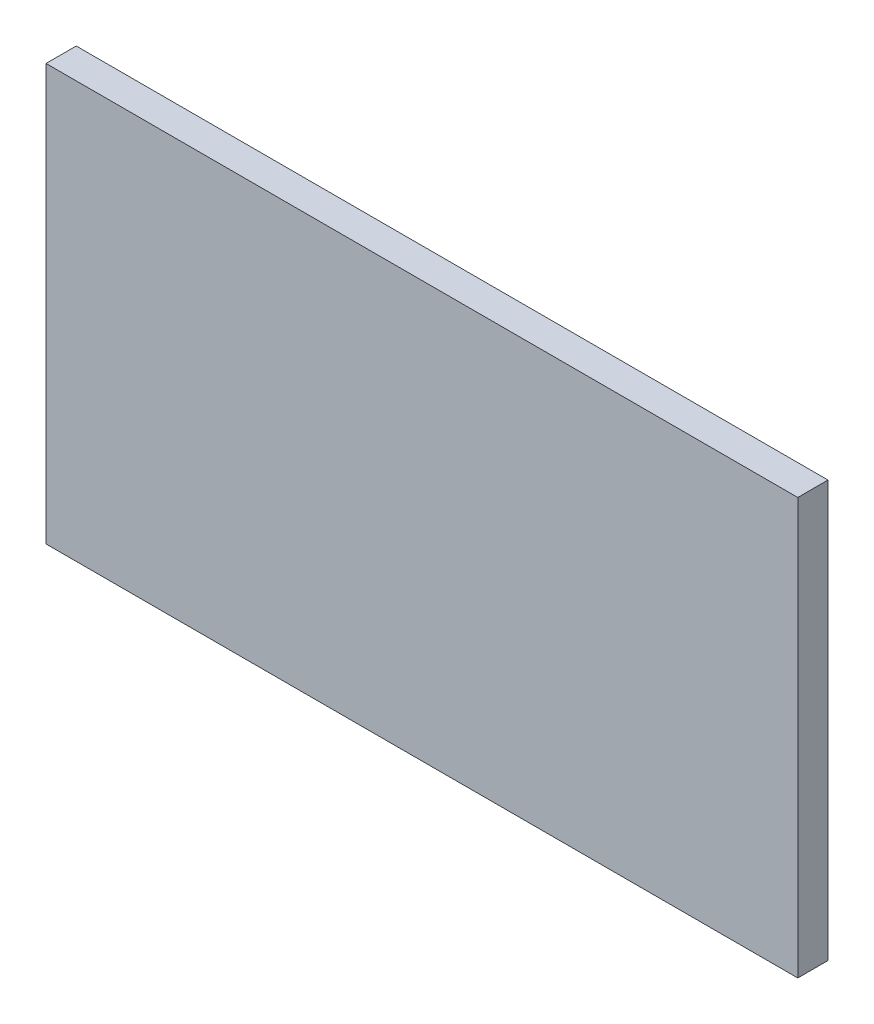
ISO-10303-21;
HEADER;
FILE_DESCRIPTION(('STEP AP214'),'2;1');
FILE_NAME('part.step','',(''),(''),'','','');
FILE_SCHEMA(('AUTOMOTIVE_DESIGN { 1 0 10303 214 1 1 1 1 }'));
ENDSEC;
DATA;
#1=APPLICATION_CONTEXT('core data for automotive mechanical design processes');
#2=APPLICATION_PROTOCOL_DEFINITION('international standard','automotive_design',2000,#1);
#3=PRODUCT_CONTEXT('',#1,'mechanical');
#4=PRODUCT('Part','Part','',(#3));
#5=PRODUCT_RELATED_PRODUCT_CATEGORY('part','',(#4));
#6=PRODUCT_DEFINITION_FORMATION('','',#4);
#7=PRODUCT_DEFINITION_CONTEXT('part definition',#1,'design');
#8=PRODUCT_DEFINITION('design','',#6,#7);
#9=PRODUCT_DEFINITION_SHAPE('','',#8);
#10=(LENGTH_UNIT() NAMED_UNIT(*) SI_UNIT(.MILLI.,.METRE.));
#11=(NAMED_UNIT(*) PLANE_ANGLE_UNIT() SI_UNIT($,.RADIAN.));
#12=(NAMED_UNIT(*) SI_UNIT($,.STERADIAN.) SOLID_ANGLE_UNIT());
#13=UNCERTAINTY_MEASURE_WITH_UNIT(LENGTH_MEASURE(1.E-05),#10,'distance_accuracy_value','');
#14=(GEOMETRIC_REPRESENTATION_CONTEXT(3) GLOBAL_UNCERTAINTY_ASSIGNED_CONTEXT((#13)) GLOBAL_UNIT_ASSIGNED_CONTEXT((#10,
#11,#12)) REPRESENTATION_CONTEXT('',''));
#15=CARTESIAN_POINT('',(0.,0.,0.));
#16=DIRECTION('',(0.,0.,1.));
#17=DIRECTION('',(1.,0.,0.));
#18=AXIS2_PLACEMENT_3D('',#15,#16,#17);
#19=CARTESIAN_POINT('',(0.,0.,9.));
#20=DIRECTION('',(1.,0.,0.));
#21=DIRECTION('',(0.,0.,-1.));
#22=AXIS2_PLACEMENT_3D('',#19,#20,#21);
#23=PLANE('',#22);
#24=DIRECTION('',(0.,-1.,0.));
#25=VECTOR('',#24,1.);
#26=CARTESIAN_POINT('',(0.,0.,-9.));
#27=LINE('',#26,#25);
#28=CARTESIAN_POINT('',(0.,248.,-9.));
#29=VERTEX_POINT('',#28);
#30=CARTESIAN_POINT('',(0.,0.,-9.));
#31=VERTEX_POINT('',#30);
#32=EDGE_CURVE('E100',#29,#31,#27,.T.);
#33=ORIENTED_EDGE('',*,*,#32,.T.);
#34=DIRECTION('',(0.,0.,-1.));
#35=VECTOR('',#34,1.);
#36=CARTESIAN_POINT('',(0.,0.,9.));
#37=LINE('',#36,#35);
#38=CARTESIAN_POINT('',(0.,0.,9.));
#39=VERTEX_POINT('',#38);
#40=EDGE_CURVE('E11',#39,#31,#37,.T.);
#41=ORIENTED_EDGE('',*,*,#40,.F.);
#42=DIRECTION('',(0.,-1.,0.));
#43=VECTOR('',#42,1.);
#44=CARTESIAN_POINT('',(0.,0.,9.));
#45=LINE('',#44,#43);
#46=CARTESIAN_POINT('',(0.,248.,9.));
#47=VERTEX_POINT('',#46);
#48=EDGE_CURVE('E88',#47,#39,#45,.T.);
#49=ORIENTED_EDGE('',*,*,#48,.F.);
#50=DIRECTION('',(0.,0.,-1.));
#51=VECTOR('',#50,1.);
#52=CARTESIAN_POINT('',(0.,248.,9.));
#53=LINE('',#52,#51);
#54=EDGE_CURVE('E96',#47,#29,#53,.T.);
#55=ORIENTED_EDGE('',*,*,#54,.T.);
#56=EDGE_LOOP('',(#33,#41,#49,#55));
#57=FACE_BOUND('',#56,.T.);
#58=ADVANCED_FACE('F37',(#57),#23,.F.);
#59=CARTESIAN_POINT('',(0.,0.,9.));
#60=DIRECTION('',(0.,1.,0.));
#61=DIRECTION('',(0.,0.,1.));
#62=AXIS2_PLACEMENT_3D('',#59,#60,#61);
#63=PLANE('',#62);
#64=DIRECTION('',(1.,0.,0.));
#65=VECTOR('',#64,1.);
#66=CARTESIAN_POINT('',(0.,0.,-9.));
#67=LINE('',#66,#65);
#68=CARTESIAN_POINT('',(448.,0.,-9.));
#69=VERTEX_POINT('',#68);
#70=EDGE_CURVE('E92',#31,#69,#67,.T.);
#71=ORIENTED_EDGE('',*,*,#70,.T.);
#72=DIRECTION('',(0.,0.,-1.));
#73=VECTOR('',#72,1.);
#74=CARTESIAN_POINT('',(448.,0.,9.));
#75=LINE('',#74,#73);
#76=CARTESIAN_POINT('',(448.,0.,9.));
#77=VERTEX_POINT('',#76);
#78=EDGE_CURVE('E45',#77,#69,#75,.T.);
#79=ORIENTED_EDGE('',*,*,#78,.F.);
#80=DIRECTION('',(1.,0.,0.));
#81=VECTOR('',#80,1.);
#82=CARTESIAN_POINT('',(0.,0.,9.));
#83=LINE('',#82,#81);
#84=EDGE_CURVE('E83',#39,#77,#83,.T.);
#85=ORIENTED_EDGE('',*,*,#84,.F.);
#86=ORIENTED_EDGE('',*,*,#40,.T.);
#87=EDGE_LOOP('',(#71,#79,#85,#86));
#88=FACE_BOUND('',#87,.T.);
#89=ADVANCED_FACE('F91',(#88),#63,.F.);
#90=CARTESIAN_POINT('',(448.,0.,9.));
#91=DIRECTION('',(-1.,0.,0.));
#92=DIRECTION('',(0.,0.,1.));
#93=AXIS2_PLACEMENT_3D('',#90,#91,#92);
#94=PLANE('',#93);
#95=DIRECTION('',(0.,1.,0.));
#96=VECTOR('',#95,1.);
#97=CARTESIAN_POINT('',(448.,0.,-9.));
#98=LINE('',#97,#96);
#99=CARTESIAN_POINT('',(448.,248.,-9.));
#100=VERTEX_POINT('',#99);
#101=EDGE_CURVE('E70',#69,#100,#98,.T.);
#102=ORIENTED_EDGE('',*,*,#101,.T.);
#103=DIRECTION('',(0.,0.,-1.));
#104=VECTOR('',#103,1.);
#105=CARTESIAN_POINT('',(448.,248.,9.));
#106=LINE('',#105,#104);
#107=CARTESIAN_POINT('',(448.,248.,9.));
#108=VERTEX_POINT('',#107);
#109=EDGE_CURVE('E93',#108,#100,#106,.T.);
#110=ORIENTED_EDGE('',*,*,#109,.F.);
#111=DIRECTION('',(0.,1.,0.));
#112=VECTOR('',#111,1.);
#113=CARTESIAN_POINT('',(448.,0.,9.));
#114=LINE('',#113,#112);
#115=EDGE_CURVE('E86',#77,#108,#114,.T.);
#116=ORIENTED_EDGE('',*,*,#115,.F.);
#117=ORIENTED_EDGE('',*,*,#78,.T.);
#118=EDGE_LOOP('',(#102,#110,#116,#117));
#119=FACE_BOUND('',#118,.T.);
#120=ADVANCED_FACE('F94',(#119),#94,.F.);
#121=CARTESIAN_POINT('',(0.,248.,9.));
#122=DIRECTION('',(0.,-1.,0.));
#123=DIRECTION('',(0.,0.,-1.));
#124=AXIS2_PLACEMENT_3D('',#121,#122,#123);
#125=PLANE('',#124);
#126=DIRECTION('',(-1.,0.,0.));
#127=VECTOR('',#126,1.);
#128=CARTESIAN_POINT('',(0.,248.,-9.));
#129=LINE('',#128,#127);
#130=EDGE_CURVE('E76',#100,#29,#129,.T.);
#131=ORIENTED_EDGE('',*,*,#130,.T.);
#132=ORIENTED_EDGE('',*,*,#54,.F.);
#133=DIRECTION('',(-1.,0.,0.));
#134=VECTOR('',#133,1.);
#135=CARTESIAN_POINT('',(0.,248.,9.));
#136=LINE('',#135,#134);
#137=EDGE_CURVE('E53',#108,#47,#136,.T.);
#138=ORIENTED_EDGE('',*,*,#137,.F.);
#139=ORIENTED_EDGE('',*,*,#109,.T.);
#140=EDGE_LOOP('',(#131,#132,#138,#139));
#141=FACE_BOUND('',#140,.T.);
#142=ADVANCED_FACE('F107',(#141),#125,.F.);
#143=CARTESIAN_POINT('',(0.,0.,9.));
#144=DIRECTION('',(0.,0.,-1.));
#145=DIRECTION('',(-1.,0.,0.));
#146=AXIS2_PLACEMENT_3D('',#143,#144,#145);
#147=PLANE('',#146);
#148=ORIENTED_EDGE('',*,*,#48,.T.);
#149=ORIENTED_EDGE('',*,*,#84,.T.);
#150=ORIENTED_EDGE('',*,*,#115,.T.);
#151=ORIENTED_EDGE('',*,*,#137,.T.);
#152=EDGE_LOOP('',(#148,#149,#150,#151));
#153=FACE_BOUND('',#152,.T.);
#154=ADVANCED_FACE('F84',(#153),#147,.F.);
#155=CARTESIAN_POINT('',(0.,0.,-9.));
#156=DIRECTION('',(0.,0.,-1.));
#157=DIRECTION('',(-1.,0.,0.));
#158=AXIS2_PLACEMENT_3D('',#155,#156,#157);
#159=PLANE('',#158);
#160=ORIENTED_EDGE('',*,*,#32,.F.);
#161=ORIENTED_EDGE('',*,*,#130,.F.);
#162=ORIENTED_EDGE('',*,*,#101,.F.);
#163=ORIENTED_EDGE('',*,*,#70,.F.);
#164=EDGE_LOOP('',(#160,#161,#162,#163));
#165=FACE_BOUND('',#164,.T.);
#166=ADVANCED_FACE('F110',(#165),#159,.T.);
#167=CLOSED_SHELL('',(#58,#89,#120,#142,#154,#166));
#168=MANIFOLD_SOLID_BREP('B2',#167);
#169=ADVANCED_BREP_SHAPE_REPRESENTATION('',(#18,#168),#14);
#170=SHAPE_DEFINITION_REPRESENTATION(#9,#169);
ENDSEC;
END-ISO-10303-21;
